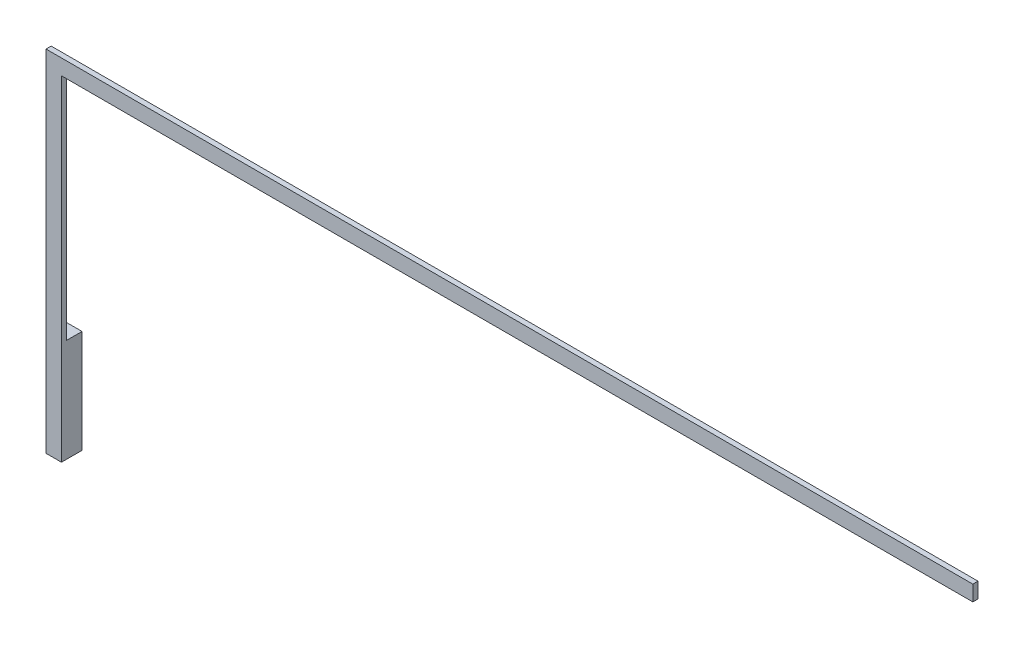
ISO-10303-21;
HEADER;
FILE_DESCRIPTION(('STEP AP214'),'2;1');
FILE_NAME('part.step','',(''),(''),'','','');
FILE_SCHEMA(('AUTOMOTIVE_DESIGN { 1 0 10303 214 1 1 1 1 }'));
ENDSEC;
DATA;
#1=APPLICATION_CONTEXT('core data for automotive mechanical design processes');
#2=APPLICATION_PROTOCOL_DEFINITION('international standard','automotive_design',2000,#1);
#3=PRODUCT_CONTEXT('',#1,'mechanical');
#4=PRODUCT('Part','Part','',(#3));
#5=PRODUCT_RELATED_PRODUCT_CATEGORY('part','',(#4));
#6=PRODUCT_DEFINITION_FORMATION('','',#4);
#7=PRODUCT_DEFINITION_CONTEXT('part definition',#1,'design');
#8=PRODUCT_DEFINITION('design','',#6,#7);
#9=PRODUCT_DEFINITION_SHAPE('','',#8);
#10=(LENGTH_UNIT() NAMED_UNIT(*) SI_UNIT(.MILLI.,.METRE.));
#11=(NAMED_UNIT(*) PLANE_ANGLE_UNIT() SI_UNIT($,.RADIAN.));
#12=(NAMED_UNIT(*) SI_UNIT($,.STERADIAN.) SOLID_ANGLE_UNIT());
#13=UNCERTAINTY_MEASURE_WITH_UNIT(LENGTH_MEASURE(1.E-05),#10,'distance_accuracy_value','');
#14=(GEOMETRIC_REPRESENTATION_CONTEXT(3) GLOBAL_UNCERTAINTY_ASSIGNED_CONTEXT((#13)) GLOBAL_UNIT_ASSIGNED_CONTEXT((#10,
#11,#12)) REPRESENTATION_CONTEXT('',''));
#15=CARTESIAN_POINT('',(0.,0.,0.));
#16=DIRECTION('',(0.,0.,1.));
#17=DIRECTION('',(1.,0.,0.));
#18=AXIS2_PLACEMENT_3D('',#15,#16,#17);
#19=CARTESIAN_POINT('',(0.,0.,0.));
#20=DIRECTION('',(0.,0.,-1.));
#21=DIRECTION('',(-1.,0.,0.));
#22=AXIS2_PLACEMENT_3D('',#19,#20,#21);
#23=PLANE('',#22);
#24=DIRECTION('',(0.,1.,0.));
#25=VECTOR('',#24,1.);
#26=CARTESIAN_POINT('',(15.,-14.996834208912,0.));
#27=LINE('',#26,#25);
#28=CARTESIAN_POINT('',(15.,-240.,0.));
#29=VERTEX_POINT('',#28);
#30=CARTESIAN_POINT('',(15.,-14.996834208912,0.));
#31=VERTEX_POINT('',#30);
#32=EDGE_CURVE('E119',#29,#31,#27,.T.);
#33=ORIENTED_EDGE('',*,*,#32,.F.);
#34=DIRECTION('',(-1.,0.,0.));
#35=VECTOR('',#34,1.);
#36=CARTESIAN_POINT('',(15.,-240.,0.));
#37=LINE('',#36,#35);
#38=CARTESIAN_POINT('',(0.,-240.,0.));
#39=VERTEX_POINT('',#38);
#40=EDGE_CURVE('E170',#29,#39,#37,.T.);
#41=ORIENTED_EDGE('',*,*,#40,.T.);
#42=DIRECTION('',(0.,-1.,0.));
#43=VECTOR('',#42,1.);
#44=CARTESIAN_POINT('',(0.,0.,0.));
#45=LINE('',#44,#43);
#46=CARTESIAN_POINT('',(0.,0.,0.));
#47=VERTEX_POINT('',#46);
#48=EDGE_CURVE('E134',#47,#39,#45,.T.);
#49=ORIENTED_EDGE('',*,*,#48,.F.);
#50=DIRECTION('',(-1.,0.,0.));
#51=VECTOR('',#50,1.);
#52=CARTESIAN_POINT('',(0.,0.,0.));
#53=LINE('',#52,#51);
#54=CARTESIAN_POINT('',(900.,0.,0.));
#55=VERTEX_POINT('',#54);
#56=EDGE_CURVE('E131',#55,#47,#53,.T.);
#57=ORIENTED_EDGE('',*,*,#56,.F.);
#58=DIRECTION('',(0.,1.,0.));
#59=VECTOR('',#58,1.);
#60=CARTESIAN_POINT('',(900.,0.,0.));
#61=LINE('',#60,#59);
#62=CARTESIAN_POINT('',(900.,-14.9968342089119,0.));
#63=VERTEX_POINT('',#62);
#64=EDGE_CURVE('E84',#63,#55,#61,.T.);
#65=ORIENTED_EDGE('',*,*,#64,.F.);
#66=DIRECTION('',(1.,0.,0.));
#67=VECTOR('',#66,1.);
#68=CARTESIAN_POINT('',(900.,-14.9968342089119,0.));
#69=LINE('',#68,#67);
#70=EDGE_CURVE('E138',#31,#63,#69,.T.);
#71=ORIENTED_EDGE('',*,*,#70,.F.);
#72=EDGE_LOOP('',(#33,#41,#49,#57,#65,#71));
#73=FACE_BOUND('',#72,.T.);
#74=ADVANCED_FACE('F39',(#73),#23,.T.);
#75=CARTESIAN_POINT('',(0.,0.,5.));
#76=DIRECTION('',(0.,-1.,0.));
#77=DIRECTION('',(0.,0.,-1.));
#78=AXIS2_PLACEMENT_3D('',#75,#76,#77);
#79=PLANE('',#78);
#80=ORIENTED_EDGE('',*,*,#56,.T.);
#81=DIRECTION('',(0.,0.,-1.));
#82=VECTOR('',#81,1.);
#83=CARTESIAN_POINT('',(0.,0.,5.));
#84=LINE('',#83,#82);
#85=CARTESIAN_POINT('',(0.,0.,5.));
#86=VERTEX_POINT('',#85);
#87=EDGE_CURVE('E11',#86,#47,#84,.T.);
#88=ORIENTED_EDGE('',*,*,#87,.F.);
#89=DIRECTION('',(-1.,0.,0.));
#90=VECTOR('',#89,1.);
#91=CARTESIAN_POINT('',(0.,0.,5.));
#92=LINE('',#91,#90);
#93=CARTESIAN_POINT('',(900.,0.,5.));
#94=VERTEX_POINT('',#93);
#95=EDGE_CURVE('E141',#94,#86,#92,.T.);
#96=ORIENTED_EDGE('',*,*,#95,.F.);
#97=DIRECTION('',(0.,0.,-1.));
#98=VECTOR('',#97,1.);
#99=CARTESIAN_POINT('',(900.,0.,5.));
#100=LINE('',#99,#98);
#101=EDGE_CURVE('E127',#94,#55,#100,.T.);
#102=ORIENTED_EDGE('',*,*,#101,.T.);
#103=EDGE_LOOP('',(#80,#88,#96,#102));
#104=FACE_BOUND('',#103,.T.);
#105=ADVANCED_FACE('F41',(#104),#79,.F.);
#106=CARTESIAN_POINT('',(0.,0.,5.));
#107=DIRECTION('',(1.,0.,0.));
#108=DIRECTION('',(0.,1.,0.));
#109=AXIS2_PLACEMENT_3D('',#106,#107,#108);
#110=PLANE('',#109);
#111=ORIENTED_EDGE('',*,*,#48,.T.);
#112=DIRECTION('',(0.,0.,1.));
#113=VECTOR('',#112,1.);
#114=CARTESIAN_POINT('',(0.,-240.,-15.));
#115=LINE('',#114,#113);
#116=CARTESIAN_POINT('',(0.,-240.,-15.));
#117=VERTEX_POINT('',#116);
#118=EDGE_CURVE('E54',#117,#39,#115,.T.);
#119=ORIENTED_EDGE('',*,*,#118,.F.);
#120=DIRECTION('',(0.,-1.,0.));
#121=VECTOR('',#120,1.);
#122=CARTESIAN_POINT('',(0.,-340.,-15.));
#123=LINE('',#122,#121);
#124=CARTESIAN_POINT('',(0.,-340.,-15.));
#125=VERTEX_POINT('',#124);
#126=EDGE_CURVE('E155',#117,#125,#123,.T.);
#127=ORIENTED_EDGE('',*,*,#126,.T.);
#128=DIRECTION('',(0.,0.,-1.));
#129=VECTOR('',#128,1.);
#130=CARTESIAN_POINT('',(0.,-340.,5.));
#131=LINE('',#130,#129);
#132=CARTESIAN_POINT('',(0.,-340.,5.));
#133=VERTEX_POINT('',#132);
#134=EDGE_CURVE('E47',#133,#125,#131,.T.);
#135=ORIENTED_EDGE('',*,*,#134,.F.);
#136=DIRECTION('',(0.,-1.,0.));
#137=VECTOR('',#136,1.);
#138=CARTESIAN_POINT('',(0.,0.,5.));
#139=LINE('',#138,#137);
#140=EDGE_CURVE('E92',#86,#133,#139,.T.);
#141=ORIENTED_EDGE('',*,*,#140,.F.);
#142=ORIENTED_EDGE('',*,*,#87,.T.);
#143=EDGE_LOOP('',(#111,#119,#127,#135,#141,#142));
#144=FACE_BOUND('',#143,.T.);
#145=ADVANCED_FACE('F156',(#144),#110,.F.);
#146=CARTESIAN_POINT('',(0.,-340.,5.));
#147=DIRECTION('',(0.,1.,0.));
#148=DIRECTION('',(0.,0.,1.));
#149=AXIS2_PLACEMENT_3D('',#146,#147,#148);
#150=PLANE('',#149);
#151=ORIENTED_EDGE('',*,*,#134,.T.);
#152=DIRECTION('',(1.,0.,0.));
#153=VECTOR('',#152,1.);
#154=CARTESIAN_POINT('',(15.,-340.,-15.));
#155=LINE('',#154,#153);
#156=CARTESIAN_POINT('',(15.,-340.,-15.));
#157=VERTEX_POINT('',#156);
#158=EDGE_CURVE('E151',#125,#157,#155,.T.);
#159=ORIENTED_EDGE('',*,*,#158,.T.);
#160=DIRECTION('',(0.,0.,-1.));
#161=VECTOR('',#160,1.);
#162=CARTESIAN_POINT('',(15.,-340.,5.));
#163=LINE('',#162,#161);
#164=CARTESIAN_POINT('',(15.,-340.,5.));
#165=VERTEX_POINT('',#164);
#166=EDGE_CURVE('E122',#165,#157,#163,.T.);
#167=ORIENTED_EDGE('',*,*,#166,.F.);
#168=DIRECTION('',(1.,0.,0.));
#169=VECTOR('',#168,1.);
#170=CARTESIAN_POINT('',(0.,-340.,5.));
#171=LINE('',#170,#169);
#172=EDGE_CURVE('E109',#133,#165,#171,.T.);
#173=ORIENTED_EDGE('',*,*,#172,.F.);
#174=EDGE_LOOP('',(#151,#159,#167,#173));
#175=FACE_BOUND('',#174,.T.);
#176=ADVANCED_FACE('F149',(#175),#150,.F.);
#177=CARTESIAN_POINT('',(15.,-14.996834208912,5.));
#178=DIRECTION('',(-1.,0.,0.));
#179=DIRECTION('',(0.,-1.,0.));
#180=AXIS2_PLACEMENT_3D('',#177,#178,#179);
#181=PLANE('',#180);
#182=ORIENTED_EDGE('',*,*,#166,.T.);
#183=DIRECTION('',(0.,1.,0.));
#184=VECTOR('',#183,1.);
#185=CARTESIAN_POINT('',(15.,-340.,-15.));
#186=LINE('',#185,#184);
#187=CARTESIAN_POINT('',(15.,-240.,-15.));
#188=VERTEX_POINT('',#187);
#189=EDGE_CURVE('E164',#157,#188,#186,.T.);
#190=ORIENTED_EDGE('',*,*,#189,.T.);
#191=DIRECTION('',(0.,0.,1.));
#192=VECTOR('',#191,1.);
#193=CARTESIAN_POINT('',(15.,-240.,-15.));
#194=LINE('',#193,#192);
#195=EDGE_CURVE('E165',#188,#29,#194,.T.);
#196=ORIENTED_EDGE('',*,*,#195,.T.);
#197=ORIENTED_EDGE('',*,*,#32,.T.);
#198=DIRECTION('',(0.,0.,-1.));
#199=VECTOR('',#198,1.);
#200=CARTESIAN_POINT('',(15.,-14.996834208912,5.));
#201=LINE('',#200,#199);
#202=CARTESIAN_POINT('',(15.,-14.996834208912,5.));
#203=VERTEX_POINT('',#202);
#204=EDGE_CURVE('E115',#203,#31,#201,.T.);
#205=ORIENTED_EDGE('',*,*,#204,.F.);
#206=DIRECTION('',(0.,1.,0.));
#207=VECTOR('',#206,1.);
#208=CARTESIAN_POINT('',(15.,-14.996834208912,5.));
#209=LINE('',#208,#207);
#210=EDGE_CURVE('E102',#165,#203,#209,.T.);
#211=ORIENTED_EDGE('',*,*,#210,.F.);
#212=EDGE_LOOP('',(#182,#190,#196,#197,#205,#211));
#213=FACE_BOUND('',#212,.T.);
#214=ADVANCED_FACE('F116',(#213),#181,.F.);
#215=CARTESIAN_POINT('',(900.,-14.9968342089119,5.));
#216=DIRECTION('',(0.,1.,0.));
#217=DIRECTION('',(-1.,0.,0.));
#218=AXIS2_PLACEMENT_3D('',#215,#216,#217);
#219=PLANE('',#218);
#220=ORIENTED_EDGE('',*,*,#70,.T.);
#221=DIRECTION('',(0.,0.,-1.));
#222=VECTOR('',#221,1.);
#223=CARTESIAN_POINT('',(900.,-14.9968342089119,5.));
#224=LINE('',#223,#222);
#225=CARTESIAN_POINT('',(900.,-14.9968342089119,5.));
#226=VERTEX_POINT('',#225);
#227=EDGE_CURVE('E123',#226,#63,#224,.T.);
#228=ORIENTED_EDGE('',*,*,#227,.F.);
#229=DIRECTION('',(1.,0.,0.));
#230=VECTOR('',#229,1.);
#231=CARTESIAN_POINT('',(900.,-14.9968342089119,5.));
#232=LINE('',#231,#230);
#233=EDGE_CURVE('E106',#203,#226,#232,.T.);
#234=ORIENTED_EDGE('',*,*,#233,.F.);
#235=ORIENTED_EDGE('',*,*,#204,.T.);
#236=EDGE_LOOP('',(#220,#228,#234,#235));
#237=FACE_BOUND('',#236,.T.);
#238=ADVANCED_FACE('F125',(#237),#219,.F.);
#239=CARTESIAN_POINT('',(900.,0.,5.));
#240=DIRECTION('',(-1.,0.,0.));
#241=DIRECTION('',(0.,0.,1.));
#242=AXIS2_PLACEMENT_3D('',#239,#240,#241);
#243=PLANE('',#242);
#244=ORIENTED_EDGE('',*,*,#64,.T.);
#245=ORIENTED_EDGE('',*,*,#101,.F.);
#246=DIRECTION('',(0.,1.,0.));
#247=VECTOR('',#246,1.);
#248=CARTESIAN_POINT('',(900.,0.,5.));
#249=LINE('',#248,#247);
#250=EDGE_CURVE('E63',#226,#94,#249,.T.);
#251=ORIENTED_EDGE('',*,*,#250,.F.);
#252=ORIENTED_EDGE('',*,*,#227,.T.);
#253=EDGE_LOOP('',(#244,#245,#251,#252));
#254=FACE_BOUND('',#253,.T.);
#255=ADVANCED_FACE('F192',(#254),#243,.F.);
#256=CARTESIAN_POINT('',(0.,0.,5.));
#257=DIRECTION('',(0.,0.,-1.));
#258=DIRECTION('',(-1.,0.,0.));
#259=AXIS2_PLACEMENT_3D('',#256,#257,#258);
#260=PLANE('',#259);
#261=ORIENTED_EDGE('',*,*,#95,.T.);
#262=ORIENTED_EDGE('',*,*,#140,.T.);
#263=ORIENTED_EDGE('',*,*,#172,.T.);
#264=ORIENTED_EDGE('',*,*,#210,.T.);
#265=ORIENTED_EDGE('',*,*,#233,.T.);
#266=ORIENTED_EDGE('',*,*,#250,.T.);
#267=EDGE_LOOP('',(#261,#262,#263,#264,#265,#266));
#268=FACE_BOUND('',#267,.T.);
#269=ADVANCED_FACE('F104',(#268),#260,.F.);
#270=CARTESIAN_POINT('',(15.,-240.,-15.));
#271=DIRECTION('',(0.,1.,0.));
#272=DIRECTION('',(0.,0.,1.));
#273=AXIS2_PLACEMENT_3D('',#270,#271,#272);
#274=PLANE('',#273);
#275=ORIENTED_EDGE('',*,*,#40,.F.);
#276=ORIENTED_EDGE('',*,*,#195,.F.);
#277=DIRECTION('',(-1.,0.,0.));
#278=VECTOR('',#277,1.);
#279=CARTESIAN_POINT('',(15.,-240.,-15.));
#280=LINE('',#279,#278);
#281=EDGE_CURVE('E159',#188,#117,#280,.T.);
#282=ORIENTED_EDGE('',*,*,#281,.T.);
#283=ORIENTED_EDGE('',*,*,#118,.T.);
#284=EDGE_LOOP('',(#275,#276,#282,#283));
#285=FACE_BOUND('',#284,.T.);
#286=ADVANCED_FACE('F180',(#285),#274,.T.);
#287=CARTESIAN_POINT('',(0.,0.,-15.));
#288=DIRECTION('',(0.,0.,1.));
#289=DIRECTION('',(1.,0.,0.));
#290=AXIS2_PLACEMENT_3D('',#287,#288,#289);
#291=PLANE('',#290);
#292=ORIENTED_EDGE('',*,*,#189,.F.);
#293=ORIENTED_EDGE('',*,*,#158,.F.);
#294=ORIENTED_EDGE('',*,*,#126,.F.);
#295=ORIENTED_EDGE('',*,*,#281,.F.);
#296=EDGE_LOOP('',(#292,#293,#294,#295));
#297=FACE_BOUND('',#296,.T.);
#298=ADVANCED_FACE('F162',(#297),#291,.F.);
#299=CLOSED_SHELL('',(#74,#105,#145,#176,#214,#238,#255,#269,#286,#298));
#300=MANIFOLD_SOLID_BREP('B2',#299);
#301=ADVANCED_BREP_SHAPE_REPRESENTATION('',(#18,#300),#14);
#302=SHAPE_DEFINITION_REPRESENTATION(#9,#301);
ENDSEC;
END-ISO-10303-21;
